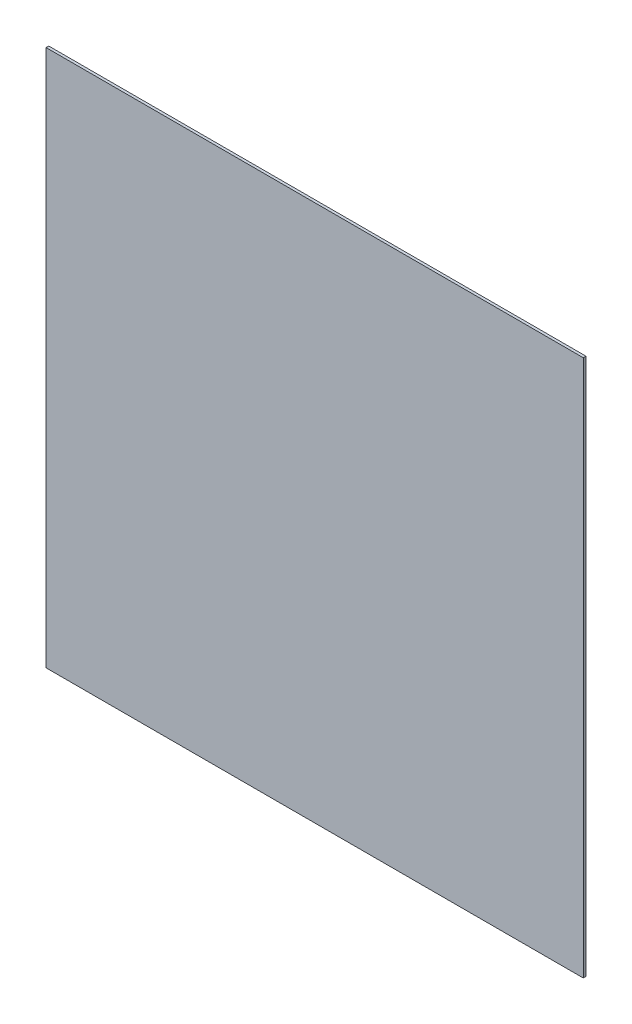
ISO-10303-21;
HEADER;
FILE_DESCRIPTION(('STEP AP214'),'2;1');
FILE_NAME('part.step','',(''),(''),'','','');
FILE_SCHEMA(('AUTOMOTIVE_DESIGN { 1 0 10303 214 1 1 1 1 }'));
ENDSEC;
DATA;
#1=APPLICATION_CONTEXT('core data for automotive mechanical design processes');
#2=APPLICATION_PROTOCOL_DEFINITION('international standard','automotive_design',2000,#1);
#3=PRODUCT_CONTEXT('',#1,'mechanical');
#4=PRODUCT('Part','Part','',(#3));
#5=PRODUCT_RELATED_PRODUCT_CATEGORY('part','',(#4));
#6=PRODUCT_DEFINITION_FORMATION('','',#4);
#7=PRODUCT_DEFINITION_CONTEXT('part definition',#1,'design');
#8=PRODUCT_DEFINITION('design','',#6,#7);
#9=PRODUCT_DEFINITION_SHAPE('','',#8);
#10=(LENGTH_UNIT() NAMED_UNIT(*) SI_UNIT(.MILLI.,.METRE.));
#11=(NAMED_UNIT(*) PLANE_ANGLE_UNIT() SI_UNIT($,.RADIAN.));
#12=(NAMED_UNIT(*) SI_UNIT($,.STERADIAN.) SOLID_ANGLE_UNIT());
#13=UNCERTAINTY_MEASURE_WITH_UNIT(LENGTH_MEASURE(1.E-05),#10,'distance_accuracy_value','');
#14=(GEOMETRIC_REPRESENTATION_CONTEXT(3) GLOBAL_UNCERTAINTY_ASSIGNED_CONTEXT((#13)) GLOBAL_UNIT_ASSIGNED_CONTEXT((#10,
#11,#12)) REPRESENTATION_CONTEXT('',''));
#15=CARTESIAN_POINT('',(0.,0.,0.));
#16=DIRECTION('',(0.,0.,1.));
#17=DIRECTION('',(1.,0.,0.));
#18=AXIS2_PLACEMENT_3D('',#15,#16,#17);
#19=CARTESIAN_POINT('',(-500.,-1008.,-5.));
#20=DIRECTION('',(-1.,0.,0.));
#21=DIRECTION('',(0.,-1.,0.));
#22=AXIS2_PLACEMENT_3D('',#19,#20,#21);
#23=PLANE('',#22);
#24=DIRECTION('',(0.,-1.,0.));
#25=VECTOR('',#24,1.);
#26=CARTESIAN_POINT('',(-500.,-1008.,0.));
#27=LINE('',#26,#25);
#28=CARTESIAN_POINT('',(-500.000000000001,-8.,0.));
#29=VERTEX_POINT('',#28);
#30=CARTESIAN_POINT('',(-500.,-1008.,0.));
#31=VERTEX_POINT('',#30);
#32=EDGE_CURVE('E95',#29,#31,#27,.T.);
#33=ORIENTED_EDGE('',*,*,#32,.F.);
#34=DIRECTION('',(0.,0.,1.));
#35=VECTOR('',#34,1.);
#36=CARTESIAN_POINT('',(-500.000000000001,-8.,-5.));
#37=LINE('',#36,#35);
#38=CARTESIAN_POINT('',(-500.000000000001,-8.,-5.));
#39=VERTEX_POINT('',#38);
#40=EDGE_CURVE('E11',#39,#29,#37,.T.);
#41=ORIENTED_EDGE('',*,*,#40,.F.);
#42=DIRECTION('',(0.,-1.,0.));
#43=VECTOR('',#42,1.);
#44=CARTESIAN_POINT('',(-500.,-1008.,-5.));
#45=LINE('',#44,#43);
#46=CARTESIAN_POINT('',(-500.,-1008.,-5.));
#47=VERTEX_POINT('',#46);
#48=EDGE_CURVE('E89',#39,#47,#45,.T.);
#49=ORIENTED_EDGE('',*,*,#48,.T.);
#50=DIRECTION('',(0.,0.,1.));
#51=VECTOR('',#50,1.);
#52=CARTESIAN_POINT('',(-500.,-1008.,-5.));
#53=LINE('',#52,#51);
#54=EDGE_CURVE('E34',#47,#31,#53,.T.);
#55=ORIENTED_EDGE('',*,*,#54,.T.);
#56=EDGE_LOOP('',(#33,#41,#49,#55));
#57=FACE_BOUND('',#56,.T.);
#58=ADVANCED_FACE('F31',(#57),#23,.T.);
#59=CARTESIAN_POINT('',(500.000000000001,-8.,-5.));
#60=DIRECTION('',(0.,1.,0.));
#61=DIRECTION('',(0.,0.,1.));
#62=AXIS2_PLACEMENT_3D('',#59,#60,#61);
#63=PLANE('',#62);
#64=DIRECTION('',(-1.,0.,0.));
#65=VECTOR('',#64,1.);
#66=CARTESIAN_POINT('',(500.000000000001,-8.,0.));
#67=LINE('',#66,#65);
#68=CARTESIAN_POINT('',(500.000000000001,-8.,0.));
#69=VERTEX_POINT('',#68);
#70=EDGE_CURVE('E91',#69,#29,#67,.T.);
#71=ORIENTED_EDGE('',*,*,#70,.F.);
#72=DIRECTION('',(0.,0.,1.));
#73=VECTOR('',#72,1.);
#74=CARTESIAN_POINT('',(500.000000000001,-8.,-5.));
#75=LINE('',#74,#73);
#76=CARTESIAN_POINT('',(500.000000000001,-8.,-5.));
#77=VERTEX_POINT('',#76);
#78=EDGE_CURVE('E40',#77,#69,#75,.T.);
#79=ORIENTED_EDGE('',*,*,#78,.F.);
#80=DIRECTION('',(-1.,0.,0.));
#81=VECTOR('',#80,1.);
#82=CARTESIAN_POINT('',(500.000000000001,-8.,-5.));
#83=LINE('',#82,#81);
#84=EDGE_CURVE('E86',#77,#39,#83,.T.);
#85=ORIENTED_EDGE('',*,*,#84,.T.);
#86=ORIENTED_EDGE('',*,*,#40,.T.);
#87=EDGE_LOOP('',(#71,#79,#85,#86));
#88=FACE_BOUND('',#87,.T.);
#89=ADVANCED_FACE('F105',(#88),#63,.T.);
#90=CARTESIAN_POINT('',(500.,-1008.,-5.));
#91=DIRECTION('',(1.,0.,0.));
#92=DIRECTION('',(0.,1.,0.));
#93=AXIS2_PLACEMENT_3D('',#90,#91,#92);
#94=PLANE('',#93);
#95=DIRECTION('',(0.,1.,0.));
#96=VECTOR('',#95,1.);
#97=CARTESIAN_POINT('',(500.,-1008.,0.));
#98=LINE('',#97,#96);
#99=CARTESIAN_POINT('',(500.,-1008.,0.));
#100=VERTEX_POINT('',#99);
#101=EDGE_CURVE('E81',#100,#69,#98,.T.);
#102=ORIENTED_EDGE('',*,*,#101,.F.);
#103=DIRECTION('',(0.,0.,1.));
#104=VECTOR('',#103,1.);
#105=CARTESIAN_POINT('',(500.,-1008.,-5.));
#106=LINE('',#105,#104);
#107=CARTESIAN_POINT('',(500.,-1008.,-5.));
#108=VERTEX_POINT('',#107);
#109=EDGE_CURVE('E76',#108,#100,#106,.T.);
#110=ORIENTED_EDGE('',*,*,#109,.F.);
#111=DIRECTION('',(0.,1.,0.));
#112=VECTOR('',#111,1.);
#113=CARTESIAN_POINT('',(500.,-1008.,-5.));
#114=LINE('',#113,#112);
#115=EDGE_CURVE('E79',#108,#77,#114,.T.);
#116=ORIENTED_EDGE('',*,*,#115,.T.);
#117=ORIENTED_EDGE('',*,*,#78,.T.);
#118=EDGE_LOOP('',(#102,#110,#116,#117));
#119=FACE_BOUND('',#118,.T.);
#120=ADVANCED_FACE('F78',(#119),#94,.T.);
#121=CARTESIAN_POINT('',(500.,-1008.,-5.));
#122=DIRECTION('',(0.,-1.,0.));
#123=DIRECTION('',(1.,0.,0.));
#124=AXIS2_PLACEMENT_3D('',#121,#122,#123);
#125=PLANE('',#124);
#126=DIRECTION('',(1.,0.,0.));
#127=VECTOR('',#126,1.);
#128=CARTESIAN_POINT('',(500.,-1008.,0.));
#129=LINE('',#128,#127);
#130=EDGE_CURVE('E98',#31,#100,#129,.T.);
#131=ORIENTED_EDGE('',*,*,#130,.F.);
#132=ORIENTED_EDGE('',*,*,#54,.F.);
#133=DIRECTION('',(1.,0.,0.));
#134=VECTOR('',#133,1.);
#135=CARTESIAN_POINT('',(500.,-1008.,-5.));
#136=LINE('',#135,#134);
#137=EDGE_CURVE('E85',#47,#108,#136,.T.);
#138=ORIENTED_EDGE('',*,*,#137,.T.);
#139=ORIENTED_EDGE('',*,*,#109,.T.);
#140=EDGE_LOOP('',(#131,#132,#138,#139));
#141=FACE_BOUND('',#140,.T.);
#142=ADVANCED_FACE('F88',(#141),#125,.T.);
#143=CARTESIAN_POINT('',(-500.000000000001,-8.,-5.));
#144=DIRECTION('',(0.,0.,1.));
#145=DIRECTION('',(1.,0.,0.));
#146=AXIS2_PLACEMENT_3D('',#143,#144,#145);
#147=PLANE('',#146);
#148=ORIENTED_EDGE('',*,*,#48,.F.);
#149=ORIENTED_EDGE('',*,*,#84,.F.);
#150=ORIENTED_EDGE('',*,*,#115,.F.);
#151=ORIENTED_EDGE('',*,*,#137,.F.);
#152=EDGE_LOOP('',(#148,#149,#150,#151));
#153=FACE_BOUND('',#152,.T.);
#154=ADVANCED_FACE('F84',(#153),#147,.F.);
#155=CARTESIAN_POINT('',(-500.000000000001,-8.,0.));
#156=DIRECTION('',(0.,0.,1.));
#157=DIRECTION('',(1.,0.,0.));
#158=AXIS2_PLACEMENT_3D('',#155,#156,#157);
#159=PLANE('',#158);
#160=ORIENTED_EDGE('',*,*,#32,.T.);
#161=ORIENTED_EDGE('',*,*,#130,.T.);
#162=ORIENTED_EDGE('',*,*,#101,.T.);
#163=ORIENTED_EDGE('',*,*,#70,.T.);
#164=EDGE_LOOP('',(#160,#161,#162,#163));
#165=FACE_BOUND('',#164,.T.);
#166=ADVANCED_FACE('F104',(#165),#159,.T.);
#167=CLOSED_SHELL('',(#58,#89,#120,#142,#154,#166));
#168=MANIFOLD_SOLID_BREP('B2',#167);
#169=ADVANCED_BREP_SHAPE_REPRESENTATION('',(#18,#168),#14);
#170=SHAPE_DEFINITION_REPRESENTATION(#9,#169);
ENDSEC;
END-ISO-10303-21;
